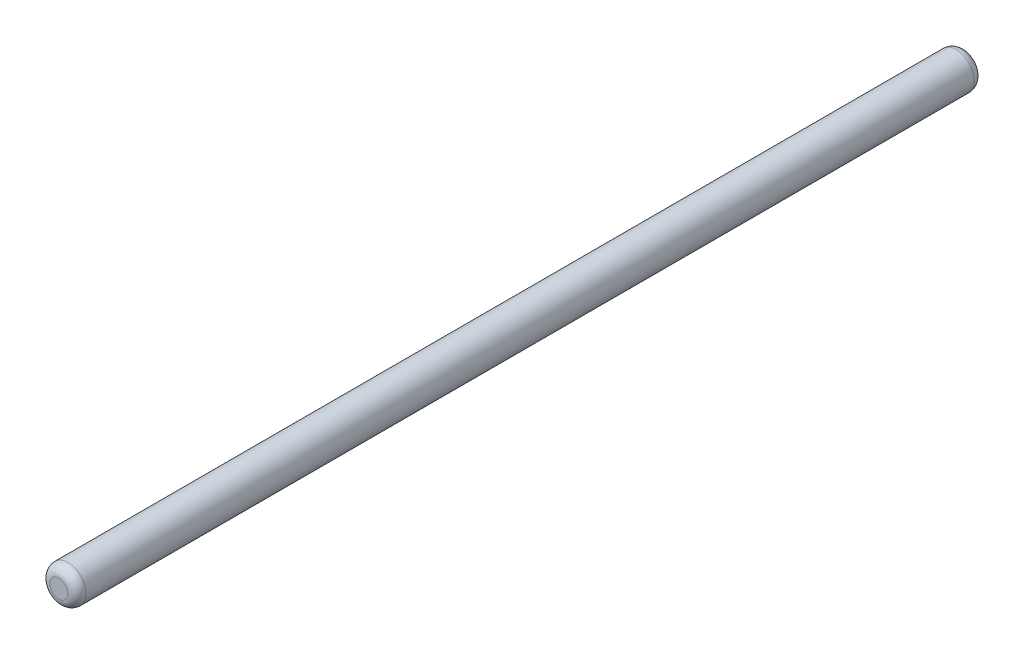
ISO-10303-21;
HEADER;
FILE_DESCRIPTION(('STEP AP214'),'2;1');
FILE_NAME('part.step','',(''),(''),'','','');
FILE_SCHEMA(('AUTOMOTIVE_DESIGN { 1 0 10303 214 1 1 1 1 }'));
ENDSEC;
DATA;
#1=APPLICATION_CONTEXT('core data for automotive mechanical design processes');
#2=APPLICATION_PROTOCOL_DEFINITION('international standard','automotive_design',2000,#1);
#3=PRODUCT_CONTEXT('',#1,'mechanical');
#4=PRODUCT('Part','Part','',(#3));
#5=PRODUCT_RELATED_PRODUCT_CATEGORY('part','',(#4));
#6=PRODUCT_DEFINITION_FORMATION('','',#4);
#7=PRODUCT_DEFINITION_CONTEXT('part definition',#1,'design');
#8=PRODUCT_DEFINITION('design','',#6,#7);
#9=PRODUCT_DEFINITION_SHAPE('','',#8);
#10=(LENGTH_UNIT() NAMED_UNIT(*) SI_UNIT(.MILLI.,.METRE.));
#11=(NAMED_UNIT(*) PLANE_ANGLE_UNIT() SI_UNIT($,.RADIAN.));
#12=(NAMED_UNIT(*) SI_UNIT($,.STERADIAN.) SOLID_ANGLE_UNIT());
#13=UNCERTAINTY_MEASURE_WITH_UNIT(LENGTH_MEASURE(1.E-05),#10,'distance_accuracy_value','');
#14=(GEOMETRIC_REPRESENTATION_CONTEXT(3) GLOBAL_UNCERTAINTY_ASSIGNED_CONTEXT((#13)) GLOBAL_UNIT_ASSIGNED_CONTEXT((#10,
#11,#12)) REPRESENTATION_CONTEXT('',''));
#15=CARTESIAN_POINT('',(0.,0.,0.));
#16=DIRECTION('',(0.,0.,1.));
#17=DIRECTION('',(1.,0.,0.));
#18=AXIS2_PLACEMENT_3D('',#15,#16,#17);
#19=CARTESIAN_POINT('',(0.,0.,500.));
#20=DIRECTION('',(0.,0.,-1.));
#21=DIRECTION('',(-1.,0.,0.));
#22=AXIS2_PLACEMENT_3D('',#19,#20,#21);
#23=CYLINDRICAL_SURFACE('',#22,10.);
#24=CARTESIAN_POINT('',(0.,0.,5.));
#25=DIRECTION('',(0.,0.,1.));
#26=DIRECTION('',(1.,0.,0.));
#27=AXIS2_PLACEMENT_3D('',#24,#25,#26);
#28=CIRCLE('',#27,10.);
#29=CARTESIAN_POINT('',(10.,0.,5.));
#30=VERTEX_POINT('',#29);
#31=EDGE_CURVE('E41',#30,#30,#28,.T.);
#32=ORIENTED_EDGE('',*,*,#31,.T.);
#33=EDGE_LOOP('',(#32));
#34=FACE_BOUND('',#33,.T.);
#35=CARTESIAN_POINT('',(0.,0.,495.));
#36=DIRECTION('',(0.,0.,1.));
#37=DIRECTION('',(1.,0.,0.));
#38=AXIS2_PLACEMENT_3D('',#35,#36,#37);
#39=CIRCLE('',#38,10.);
#40=CARTESIAN_POINT('',(10.,0.,495.));
#41=VERTEX_POINT('',#40);
#42=EDGE_CURVE('E45',#41,#41,#39,.F.);
#43=ORIENTED_EDGE('',*,*,#42,.T.);
#44=EDGE_LOOP('',(#43));
#45=FACE_BOUND('',#44,.T.);
#46=ADVANCED_FACE('F34',(#34,#45),#23,.T.);
#47=CARTESIAN_POINT('',(0.,0.,500.));
#48=DIRECTION('',(0.,0.,1.));
#49=DIRECTION('',(1.,0.,0.));
#50=AXIS2_PLACEMENT_3D('',#47,#48,#49);
#51=PLANE('',#50);
#52=CARTESIAN_POINT('',(0.,0.,500.));
#53=DIRECTION('',(0.,0.,1.));
#54=DIRECTION('',(1.,0.,0.));
#55=AXIS2_PLACEMENT_3D('',#52,#53,#54);
#56=CIRCLE('',#55,5.);
#57=CARTESIAN_POINT('',(5.,0.,500.));
#58=VERTEX_POINT('',#57);
#59=EDGE_CURVE('E49',#58,#58,#56,.T.);
#60=ORIENTED_EDGE('',*,*,#59,.T.);
#61=EDGE_LOOP('',(#60));
#62=FACE_BOUND('',#61,.T.);
#63=ADVANCED_FACE('F55',(#62),#51,.T.);
#64=CARTESIAN_POINT('',(0.,0.,0.));
#65=DIRECTION('',(0.,0.,1.));
#66=DIRECTION('',(1.,0.,0.));
#67=AXIS2_PLACEMENT_3D('',#64,#65,#66);
#68=PLANE('',#67);
#69=CARTESIAN_POINT('',(0.,0.,0.));
#70=DIRECTION('',(0.,0.,1.));
#71=DIRECTION('',(1.,0.,0.));
#72=AXIS2_PLACEMENT_3D('',#69,#70,#71);
#73=CIRCLE('',#72,5.);
#74=CARTESIAN_POINT('',(5.,0.,0.));
#75=VERTEX_POINT('',#74);
#76=EDGE_CURVE('E10',#75,#75,#73,.F.);
#77=ORIENTED_EDGE('',*,*,#76,.T.);
#78=EDGE_LOOP('',(#77));
#79=FACE_BOUND('',#78,.T.);
#80=ADVANCED_FACE('F59',(#79),#68,.F.);
#81=CARTESIAN_POINT('',(0.,0.,495.));
#82=DIRECTION('',(0.,0.,1.));
#83=DIRECTION('',(1.,0.,0.));
#84=AXIS2_PLACEMENT_3D('',#81,#82,#83);
#85=TOROIDAL_SURFACE('',#84,5.,5.);
#86=ORIENTED_EDGE('',*,*,#42,.F.);
#87=EDGE_LOOP('',(#86));
#88=FACE_BOUND('',#87,.T.);
#89=ORIENTED_EDGE('',*,*,#59,.F.);
#90=EDGE_LOOP('',(#89));
#91=FACE_BOUND('',#90,.T.);
#92=ADVANCED_FACE('F57',(#88,#91),#85,.T.);
#93=CARTESIAN_POINT('',(0.,0.,5.));
#94=DIRECTION('',(0.,0.,1.));
#95=DIRECTION('',(1.,0.,0.));
#96=AXIS2_PLACEMENT_3D('',#93,#94,#95);
#97=TOROIDAL_SURFACE('',#96,5.,5.);
#98=ORIENTED_EDGE('',*,*,#76,.F.);
#99=EDGE_LOOP('',(#98));
#100=FACE_BOUND('',#99,.T.);
#101=ORIENTED_EDGE('',*,*,#31,.F.);
#102=EDGE_LOOP('',(#101));
#103=FACE_BOUND('',#102,.T.);
#104=ADVANCED_FACE('F36',(#100,#103),#97,.T.);
#105=CLOSED_SHELL('',(#46,#63,#80,#92,#104));
#106=MANIFOLD_SOLID_BREP('B2',#105);
#107=ADVANCED_BREP_SHAPE_REPRESENTATION('',(#18,#106),#14);
#108=SHAPE_DEFINITION_REPRESENTATION(#9,#107);
ENDSEC;
END-ISO-10303-21;
